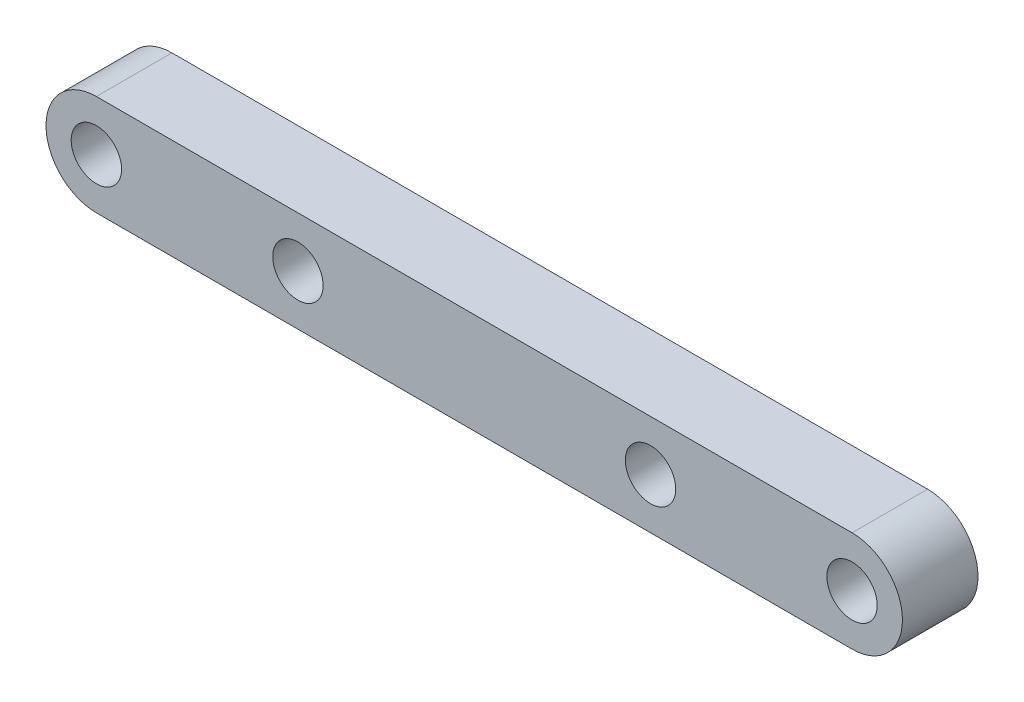
ISO-10303-21;
HEADER;
FILE_DESCRIPTION(('STEP AP214'),'2;1');
FILE_NAME('part.step','',(''),(''),'','','');
FILE_SCHEMA(('AUTOMOTIVE_DESIGN { 1 0 10303 214 1 1 1 1 }'));
ENDSEC;
DATA;
#1=APPLICATION_CONTEXT('core data for automotive mechanical design processes');
#2=APPLICATION_PROTOCOL_DEFINITION('international standard','automotive_design',2000,#1);
#3=PRODUCT_CONTEXT('',#1,'mechanical');
#4=PRODUCT('Part','Part','',(#3));
#5=PRODUCT_RELATED_PRODUCT_CATEGORY('part','',(#4));
#6=PRODUCT_DEFINITION_FORMATION('','',#4);
#7=PRODUCT_DEFINITION_CONTEXT('part definition',#1,'design');
#8=PRODUCT_DEFINITION('design','',#6,#7);
#9=PRODUCT_DEFINITION_SHAPE('','',#8);
#10=(LENGTH_UNIT() NAMED_UNIT(*) SI_UNIT(.MILLI.,.METRE.));
#11=(NAMED_UNIT(*) PLANE_ANGLE_UNIT() SI_UNIT($,.RADIAN.));
#12=(NAMED_UNIT(*) SI_UNIT($,.STERADIAN.) SOLID_ANGLE_UNIT());
#13=UNCERTAINTY_MEASURE_WITH_UNIT(LENGTH_MEASURE(1.E-05),#10,'distance_accuracy_value','');
#14=(GEOMETRIC_REPRESENTATION_CONTEXT(3) GLOBAL_UNCERTAINTY_ASSIGNED_CONTEXT((#13)) GLOBAL_UNIT_ASSIGNED_CONTEXT((#10,
#11,#12)) REPRESENTATION_CONTEXT('',''));
#15=CARTESIAN_POINT('',(0.,0.,0.));
#16=DIRECTION('',(0.,0.,1.));
#17=DIRECTION('',(1.,0.,0.));
#18=AXIS2_PLACEMENT_3D('',#15,#16,#17);
#19=CARTESIAN_POINT('',(-15.,0.,3.));
#20=DIRECTION('',(0.,0.,1.));
#21=DIRECTION('',(1.,0.,0.));
#22=AXIS2_PLACEMENT_3D('',#19,#20,#21);
#23=PLANE('',#22);
#24=CARTESIAN_POINT('',(-7.,0.,3.));
#25=DIRECTION('',(0.,0.,1.));
#26=DIRECTION('',(1.,0.,0.));
#27=AXIS2_PLACEMENT_3D('',#24,#25,#26);
#28=CIRCLE('',#27,1.);
#29=CARTESIAN_POINT('',(-6.,0.,3.));
#30=VERTEX_POINT('',#29);
#31=EDGE_CURVE('E125',#30,#30,#28,.T.);
#32=ORIENTED_EDGE('',*,*,#31,.F.);
#33=EDGE_LOOP('',(#32));
#34=FACE_BOUND('',#33,.T.);
#35=CARTESIAN_POINT('',(15.,0.,3.));
#36=DIRECTION('',(0.,0.,1.));
#37=DIRECTION('',(1.,0.,0.));
#38=AXIS2_PLACEMENT_3D('',#35,#36,#37);
#39=CIRCLE('',#38,1.);
#40=CARTESIAN_POINT('',(16.,0.,3.));
#41=VERTEX_POINT('',#40);
#42=EDGE_CURVE('E104',#41,#41,#39,.T.);
#43=ORIENTED_EDGE('',*,*,#42,.F.);
#44=EDGE_LOOP('',(#43));
#45=FACE_BOUND('',#44,.T.);
#46=CARTESIAN_POINT('',(-15.,0.,3.));
#47=DIRECTION('',(0.,0.,1.));
#48=DIRECTION('',(1.,0.,0.));
#49=AXIS2_PLACEMENT_3D('',#46,#47,#48);
#50=CIRCLE('',#49,2.);
#51=CARTESIAN_POINT('',(-15.,2.,3.));
#52=VERTEX_POINT('',#51);
#53=CARTESIAN_POINT('',(-15.,-2.,3.));
#54=VERTEX_POINT('',#53);
#55=EDGE_CURVE('E89',#52,#54,#50,.T.);
#56=ORIENTED_EDGE('',*,*,#55,.T.);
#57=DIRECTION('',(1.,0.,0.));
#58=VECTOR('',#57,1.);
#59=CARTESIAN_POINT('',(-15.,-2.,3.));
#60=LINE('',#59,#58);
#61=CARTESIAN_POINT('',(15.,-2.,3.));
#62=VERTEX_POINT('',#61);
#63=EDGE_CURVE('E84',#54,#62,#60,.T.);
#64=ORIENTED_EDGE('',*,*,#63,.T.);
#65=CARTESIAN_POINT('',(15.,0.,3.));
#66=DIRECTION('',(0.,0.,1.));
#67=DIRECTION('',(1.,0.,0.));
#68=AXIS2_PLACEMENT_3D('',#65,#66,#67);
#69=CIRCLE('',#68,2.);
#70=CARTESIAN_POINT('',(15.,2.,3.));
#71=VERTEX_POINT('',#70);
#72=EDGE_CURVE('E87',#62,#71,#69,.T.);
#73=ORIENTED_EDGE('',*,*,#72,.T.);
#74=DIRECTION('',(-1.,0.,0.));
#75=VECTOR('',#74,1.);
#76=CARTESIAN_POINT('',(-15.,2.,3.));
#77=LINE('',#76,#75);
#78=EDGE_CURVE('E54',#71,#52,#77,.T.);
#79=ORIENTED_EDGE('',*,*,#78,.T.);
#80=EDGE_LOOP('',(#56,#64,#73,#79));
#81=FACE_BOUND('',#80,.T.);
#82=CARTESIAN_POINT('',(-15.,0.,3.));
#83=DIRECTION('',(0.,0.,1.));
#84=DIRECTION('',(1.,0.,0.));
#85=AXIS2_PLACEMENT_3D('',#82,#83,#84);
#86=CIRCLE('',#85,1.);
#87=CARTESIAN_POINT('',(-14.,0.,3.));
#88=VERTEX_POINT('',#87);
#89=EDGE_CURVE('E119',#88,#88,#86,.T.);
#90=ORIENTED_EDGE('',*,*,#89,.F.);
#91=EDGE_LOOP('',(#90));
#92=FACE_BOUND('',#91,.T.);
#93=CARTESIAN_POINT('',(7.,0.,3.));
#94=DIRECTION('',(0.,0.,1.));
#95=DIRECTION('',(-1.,0.,0.));
#96=AXIS2_PLACEMENT_3D('',#93,#94,#95);
#97=CIRCLE('',#96,1.);
#98=CARTESIAN_POINT('',(6.,0.,3.));
#99=VERTEX_POINT('',#98);
#100=EDGE_CURVE('E131',#99,#99,#97,.T.);
#101=ORIENTED_EDGE('',*,*,#100,.F.);
#102=EDGE_LOOP('',(#101));
#103=FACE_BOUND('',#102,.T.);
#104=ADVANCED_FACE('F37',(#34,#45,#81,#92,#103),#23,.T.);
#105=CARTESIAN_POINT('',(-15.,0.,0.));
#106=DIRECTION('',(0.,0.,1.));
#107=DIRECTION('',(1.,0.,0.));
#108=AXIS2_PLACEMENT_3D('',#105,#106,#107);
#109=PLANE('',#108);
#110=CARTESIAN_POINT('',(-15.,0.,0.));
#111=DIRECTION('',(0.,0.,1.));
#112=DIRECTION('',(1.,0.,0.));
#113=AXIS2_PLACEMENT_3D('',#110,#111,#112);
#114=CIRCLE('',#113,2.);
#115=CARTESIAN_POINT('',(-15.,2.,0.));
#116=VERTEX_POINT('',#115);
#117=CARTESIAN_POINT('',(-15.,-2.,0.));
#118=VERTEX_POINT('',#117);
#119=EDGE_CURVE('E101',#116,#118,#114,.T.);
#120=ORIENTED_EDGE('',*,*,#119,.F.);
#121=DIRECTION('',(-1.,0.,0.));
#122=VECTOR('',#121,1.);
#123=CARTESIAN_POINT('',(-15.,2.,0.));
#124=LINE('',#123,#122);
#125=CARTESIAN_POINT('',(15.,2.,0.));
#126=VERTEX_POINT('',#125);
#127=EDGE_CURVE('E77',#126,#116,#124,.T.);
#128=ORIENTED_EDGE('',*,*,#127,.F.);
#129=CARTESIAN_POINT('',(15.,0.,0.));
#130=DIRECTION('',(0.,0.,1.));
#131=DIRECTION('',(1.,0.,0.));
#132=AXIS2_PLACEMENT_3D('',#129,#130,#131);
#133=CIRCLE('',#132,2.);
#134=CARTESIAN_POINT('',(15.,-2.,0.));
#135=VERTEX_POINT('',#134);
#136=EDGE_CURVE('E71',#135,#126,#133,.T.);
#137=ORIENTED_EDGE('',*,*,#136,.F.);
#138=DIRECTION('',(1.,0.,0.));
#139=VECTOR('',#138,1.);
#140=CARTESIAN_POINT('',(-15.,-2.,0.));
#141=LINE('',#140,#139);
#142=EDGE_CURVE('E93',#118,#135,#141,.T.);
#143=ORIENTED_EDGE('',*,*,#142,.F.);
#144=EDGE_LOOP('',(#120,#128,#137,#143));
#145=FACE_BOUND('',#144,.T.);
#146=CARTESIAN_POINT('',(15.,0.,0.));
#147=DIRECTION('',(0.,0.,1.));
#148=DIRECTION('',(1.,0.,0.));
#149=AXIS2_PLACEMENT_3D('',#146,#147,#148);
#150=CIRCLE('',#149,1.);
#151=CARTESIAN_POINT('',(16.,0.,0.));
#152=VERTEX_POINT('',#151);
#153=EDGE_CURVE('E116',#152,#152,#150,.T.);
#154=ORIENTED_EDGE('',*,*,#153,.T.);
#155=EDGE_LOOP('',(#154));
#156=FACE_BOUND('',#155,.T.);
#157=CARTESIAN_POINT('',(-15.,0.,0.));
#158=DIRECTION('',(0.,0.,1.));
#159=DIRECTION('',(1.,0.,0.));
#160=AXIS2_PLACEMENT_3D('',#157,#158,#159);
#161=CIRCLE('',#160,1.);
#162=CARTESIAN_POINT('',(-14.,0.,0.));
#163=VERTEX_POINT('',#162);
#164=EDGE_CURVE('E122',#163,#163,#161,.T.);
#165=ORIENTED_EDGE('',*,*,#164,.T.);
#166=EDGE_LOOP('',(#165));
#167=FACE_BOUND('',#166,.T.);
#168=CARTESIAN_POINT('',(-7.,0.,0.));
#169=DIRECTION('',(0.,0.,1.));
#170=DIRECTION('',(1.,0.,0.));
#171=AXIS2_PLACEMENT_3D('',#168,#169,#170);
#172=CIRCLE('',#171,1.);
#173=CARTESIAN_POINT('',(-6.,0.,0.));
#174=VERTEX_POINT('',#173);
#175=EDGE_CURVE('E128',#174,#174,#172,.T.);
#176=ORIENTED_EDGE('',*,*,#175,.T.);
#177=EDGE_LOOP('',(#176));
#178=FACE_BOUND('',#177,.T.);
#179=CARTESIAN_POINT('',(7.,0.,0.));
#180=DIRECTION('',(0.,0.,1.));
#181=DIRECTION('',(-1.,0.,0.));
#182=AXIS2_PLACEMENT_3D('',#179,#180,#181);
#183=CIRCLE('',#182,1.);
#184=CARTESIAN_POINT('',(6.,0.,0.));
#185=VERTEX_POINT('',#184);
#186=EDGE_CURVE('E134',#185,#185,#183,.T.);
#187=ORIENTED_EDGE('',*,*,#186,.T.);
#188=EDGE_LOOP('',(#187));
#189=FACE_BOUND('',#188,.T.);
#190=ADVANCED_FACE('F112',(#145,#156,#167,#178,#189),#109,.F.);
#191=CARTESIAN_POINT('',(-15.,0.,3.));
#192=DIRECTION('',(0.,0.,-1.));
#193=DIRECTION('',(-1.,0.,0.));
#194=AXIS2_PLACEMENT_3D('',#191,#192,#193);
#195=CYLINDRICAL_SURFACE('',#194,2.);
#196=ORIENTED_EDGE('',*,*,#119,.T.);
#197=DIRECTION('',(0.,0.,-1.));
#198=VECTOR('',#197,1.);
#199=CARTESIAN_POINT('',(-15.,-2.,3.));
#200=LINE('',#199,#198);
#201=EDGE_CURVE('E11',#54,#118,#200,.T.);
#202=ORIENTED_EDGE('',*,*,#201,.F.);
#203=ORIENTED_EDGE('',*,*,#55,.F.);
#204=DIRECTION('',(0.,0.,-1.));
#205=VECTOR('',#204,1.);
#206=CARTESIAN_POINT('',(-15.,2.,3.));
#207=LINE('',#206,#205);
#208=EDGE_CURVE('E97',#52,#116,#207,.T.);
#209=ORIENTED_EDGE('',*,*,#208,.T.);
#210=EDGE_LOOP('',(#196,#202,#203,#209));
#211=FACE_BOUND('',#210,.T.);
#212=ADVANCED_FACE('F39',(#211),#195,.T.);
#213=CARTESIAN_POINT('',(-15.,-2.,3.));
#214=DIRECTION('',(0.,1.,0.));
#215=DIRECTION('',(0.,0.,1.));
#216=AXIS2_PLACEMENT_3D('',#213,#214,#215);
#217=PLANE('',#216);
#218=ORIENTED_EDGE('',*,*,#142,.T.);
#219=DIRECTION('',(0.,0.,-1.));
#220=VECTOR('',#219,1.);
#221=CARTESIAN_POINT('',(15.,-2.,3.));
#222=LINE('',#221,#220);
#223=EDGE_CURVE('E46',#62,#135,#222,.T.);
#224=ORIENTED_EDGE('',*,*,#223,.F.);
#225=ORIENTED_EDGE('',*,*,#63,.F.);
#226=ORIENTED_EDGE('',*,*,#201,.T.);
#227=EDGE_LOOP('',(#218,#224,#225,#226));
#228=FACE_BOUND('',#227,.T.);
#229=ADVANCED_FACE('F92',(#228),#217,.F.);
#230=CARTESIAN_POINT('',(15.,0.,3.));
#231=DIRECTION('',(0.,0.,-1.));
#232=DIRECTION('',(-1.,0.,0.));
#233=AXIS2_PLACEMENT_3D('',#230,#231,#232);
#234=CYLINDRICAL_SURFACE('',#233,2.);
#235=ORIENTED_EDGE('',*,*,#136,.T.);
#236=DIRECTION('',(0.,0.,-1.));
#237=VECTOR('',#236,1.);
#238=CARTESIAN_POINT('',(15.,2.,3.));
#239=LINE('',#238,#237);
#240=EDGE_CURVE('E94',#71,#126,#239,.T.);
#241=ORIENTED_EDGE('',*,*,#240,.F.);
#242=ORIENTED_EDGE('',*,*,#72,.F.);
#243=ORIENTED_EDGE('',*,*,#223,.T.);
#244=EDGE_LOOP('',(#235,#241,#242,#243));
#245=FACE_BOUND('',#244,.T.);
#246=ADVANCED_FACE('F95',(#245),#234,.T.);
#247=CARTESIAN_POINT('',(-15.,2.,3.));
#248=DIRECTION('',(0.,-1.,0.));
#249=DIRECTION('',(1.,0.,0.));
#250=AXIS2_PLACEMENT_3D('',#247,#248,#249);
#251=PLANE('',#250);
#252=ORIENTED_EDGE('',*,*,#127,.T.);
#253=ORIENTED_EDGE('',*,*,#208,.F.);
#254=ORIENTED_EDGE('',*,*,#78,.F.);
#255=ORIENTED_EDGE('',*,*,#240,.T.);
#256=EDGE_LOOP('',(#252,#253,#254,#255));
#257=FACE_BOUND('',#256,.T.);
#258=ADVANCED_FACE('F109',(#257),#251,.F.);
#259=CARTESIAN_POINT('',(15.,0.,3.));
#260=DIRECTION('',(0.,0.,-1.));
#261=DIRECTION('',(-1.,0.,0.));
#262=AXIS2_PLACEMENT_3D('',#259,#260,#261);
#263=CYLINDRICAL_SURFACE('',#262,1.);
#264=ORIENTED_EDGE('',*,*,#42,.T.);
#265=EDGE_LOOP('',(#264));
#266=FACE_BOUND('',#265,.T.);
#267=ORIENTED_EDGE('',*,*,#153,.F.);
#268=EDGE_LOOP('',(#267));
#269=FACE_BOUND('',#268,.T.);
#270=ADVANCED_FACE('F153',(#266,#269),#263,.F.);
#271=CARTESIAN_POINT('',(-15.,0.,3.));
#272=DIRECTION('',(0.,0.,-1.));
#273=DIRECTION('',(-1.,0.,0.));
#274=AXIS2_PLACEMENT_3D('',#271,#272,#273);
#275=CYLINDRICAL_SURFACE('',#274,1.);
#276=ORIENTED_EDGE('',*,*,#89,.T.);
#277=EDGE_LOOP('',(#276));
#278=FACE_BOUND('',#277,.T.);
#279=ORIENTED_EDGE('',*,*,#164,.F.);
#280=EDGE_LOOP('',(#279));
#281=FACE_BOUND('',#280,.T.);
#282=ADVANCED_FACE('F207',(#278,#281),#275,.F.);
#283=CARTESIAN_POINT('',(-7.,0.,3.));
#284=DIRECTION('',(0.,0.,-1.));
#285=DIRECTION('',(-1.,0.,0.));
#286=AXIS2_PLACEMENT_3D('',#283,#284,#285);
#287=CYLINDRICAL_SURFACE('',#286,1.);
#288=ORIENTED_EDGE('',*,*,#31,.T.);
#289=EDGE_LOOP('',(#288));
#290=FACE_BOUND('',#289,.T.);
#291=ORIENTED_EDGE('',*,*,#175,.F.);
#292=EDGE_LOOP('',(#291));
#293=FACE_BOUND('',#292,.T.);
#294=ADVANCED_FACE('F216',(#290,#293),#287,.F.);
#295=CARTESIAN_POINT('',(7.,0.,3.));
#296=DIRECTION('',(0.,0.,-1.));
#297=DIRECTION('',(-1.,0.,0.));
#298=AXIS2_PLACEMENT_3D('',#295,#296,#297);
#299=CYLINDRICAL_SURFACE('',#298,1.);
#300=ORIENTED_EDGE('',*,*,#100,.T.);
#301=EDGE_LOOP('',(#300));
#302=FACE_BOUND('',#301,.T.);
#303=ORIENTED_EDGE('',*,*,#186,.F.);
#304=EDGE_LOOP('',(#303));
#305=FACE_BOUND('',#304,.T.);
#306=ADVANCED_FACE('F140',(#302,#305),#299,.F.);
#307=CLOSED_SHELL('',(#104,#190,#212,#229,#246,#258,#270,#282,#294,#306));
#308=MANIFOLD_SOLID_BREP('B2',#307);
#309=ADVANCED_BREP_SHAPE_REPRESENTATION('',(#18,#308),#14);
#310=SHAPE_DEFINITION_REPRESENTATION(#9,#309);
ENDSEC;
END-ISO-10303-21;
